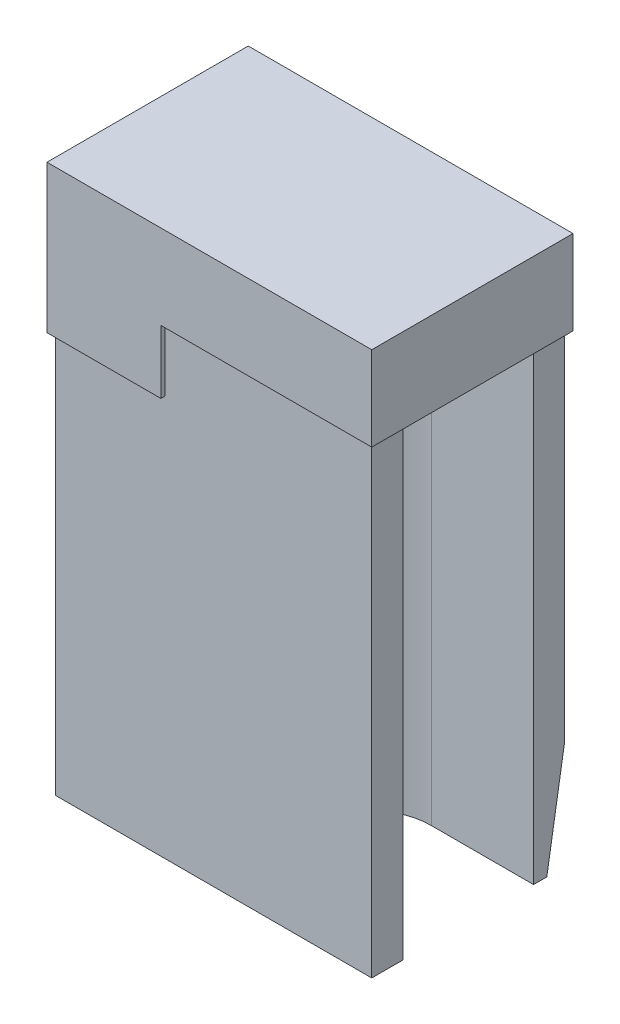
ISO-10303-21;
HEADER;
FILE_DESCRIPTION(('STEP AP214'),'2;1');
FILE_NAME('part.step','',(''),(''),'','','');
FILE_SCHEMA(('AUTOMOTIVE_DESIGN { 1 0 10303 214 1 1 1 1 }'));
ENDSEC;
DATA;
#1=APPLICATION_CONTEXT('core data for automotive mechanical design processes');
#2=APPLICATION_PROTOCOL_DEFINITION('international standard','automotive_design',2000,#1);
#3=PRODUCT_CONTEXT('',#1,'mechanical');
#4=PRODUCT('Part','Part','',(#3));
#5=PRODUCT_RELATED_PRODUCT_CATEGORY('part','',(#4));
#6=PRODUCT_DEFINITION_FORMATION('','',#4);
#7=PRODUCT_DEFINITION_CONTEXT('part definition',#1,'design');
#8=PRODUCT_DEFINITION('design','',#6,#7);
#9=PRODUCT_DEFINITION_SHAPE('','',#8);
#10=(LENGTH_UNIT() NAMED_UNIT(*) SI_UNIT(.MILLI.,.METRE.));
#11=(NAMED_UNIT(*) PLANE_ANGLE_UNIT() SI_UNIT($,.RADIAN.));
#12=(NAMED_UNIT(*) SI_UNIT($,.STERADIAN.) SOLID_ANGLE_UNIT());
#13=UNCERTAINTY_MEASURE_WITH_UNIT(LENGTH_MEASURE(1.E-05),#10,'distance_accuracy_value','');
#14=(GEOMETRIC_REPRESENTATION_CONTEXT(3) GLOBAL_UNCERTAINTY_ASSIGNED_CONTEXT((#13)) GLOBAL_UNIT_ASSIGNED_CONTEXT((#10,
#11,#12)) REPRESENTATION_CONTEXT('',''));
#15=CARTESIAN_POINT('',(0.,0.,0.));
#16=DIRECTION('',(0.,0.,1.));
#17=DIRECTION('',(1.,0.,0.));
#18=AXIS2_PLACEMENT_3D('',#15,#16,#17);
#19=CARTESIAN_POINT('',(-50.8,95.,-22.86));
#20=DIRECTION('',(1.,0.,0.));
#21=DIRECTION('',(0.,0.,-1.));
#22=AXIS2_PLACEMENT_3D('',#19,#20,#21);
#23=PLANE('',#22);
#24=DIRECTION('',(0.,-1.,0.));
#25=VECTOR('',#24,1.);
#26=CARTESIAN_POINT('',(-50.8,95.,-22.86));
#27=LINE('',#26,#25);
#28=CARTESIAN_POINT('',(-50.8,95.,-22.86));
#29=VERTEX_POINT('',#28);
#30=CARTESIAN_POINT('',(-50.8,25.5524,-22.86));
#31=VERTEX_POINT('',#30);
#32=EDGE_CURVE('E253',#29,#31,#27,.T.);
#33=ORIENTED_EDGE('',*,*,#32,.T.);
#34=DIRECTION('',(0.,-0.986657715435994,0.162808330777709));
#35=VECTOR('',#34,1.);
#36=CARTESIAN_POINT('',(-50.8,0.,-18.6436));
#37=LINE('',#36,#35);
#38=CARTESIAN_POINT('',(-50.8,0.,-18.6436));
#39=VERTEX_POINT('',#38);
#40=EDGE_CURVE('E236',#31,#39,#37,.T.);
#41=ORIENTED_EDGE('',*,*,#40,.T.);
#42=DIRECTION('',(0.,0.,1.));
#43=VECTOR('',#42,1.);
#44=CARTESIAN_POINT('',(-50.8,0.,-22.86));
#45=LINE('',#44,#43);
#46=CARTESIAN_POINT('',(-50.8,0.,22.86));
#47=VERTEX_POINT('',#46);
#48=EDGE_CURVE('E243',#39,#47,#45,.T.);
#49=ORIENTED_EDGE('',*,*,#48,.T.);
#50=DIRECTION('',(0.,-1.,0.));
#51=VECTOR('',#50,1.);
#52=CARTESIAN_POINT('',(-50.8,95.,22.86));
#53=LINE('',#52,#51);
#54=CARTESIAN_POINT('',(-50.8,95.,22.86));
#55=VERTEX_POINT('',#54);
#56=EDGE_CURVE('E11',#55,#47,#53,.T.);
#57=ORIENTED_EDGE('',*,*,#56,.F.);
#58=DIRECTION('',(0.,0.,1.));
#59=VECTOR('',#58,1.);
#60=CARTESIAN_POINT('',(-50.8,95.,-22.86));
#61=LINE('',#60,#59);
#62=EDGE_CURVE('E245',#29,#55,#61,.T.);
#63=ORIENTED_EDGE('',*,*,#62,.F.);
#64=EDGE_LOOP('',(#33,#41,#49,#57,#63));
#65=FACE_BOUND('',#64,.T.);
#66=ADVANCED_FACE('F34',(#65),#23,.F.);
#67=CARTESIAN_POINT('',(-50.8,95.,22.86));
#68=DIRECTION('',(0.,0.,-1.));
#69=DIRECTION('',(-1.,0.,0.));
#70=AXIS2_PLACEMENT_3D('',#67,#68,#69);
#71=PLANE('',#70);
#72=DIRECTION('',(1.,0.,0.));
#73=VECTOR('',#72,1.);
#74=CARTESIAN_POINT('',(-50.8,0.,22.86));
#75=LINE('',#74,#73);
#76=CARTESIAN_POINT('',(24.2,0.,22.86));
#77=VERTEX_POINT('',#76);
#78=EDGE_CURVE('E255',#47,#77,#75,.T.);
#79=ORIENTED_EDGE('',*,*,#78,.T.);
#80=DIRECTION('',(0.,-1.,0.));
#81=VECTOR('',#80,1.);
#82=CARTESIAN_POINT('',(24.2,95.,22.86));
#83=LINE('',#82,#81);
#84=CARTESIAN_POINT('',(24.2,110.,22.86));
#85=VERTEX_POINT('',#84);
#86=EDGE_CURVE('E41',#85,#77,#83,.T.);
#87=ORIENTED_EDGE('',*,*,#86,.F.);
#88=DIRECTION('',(1.,0.,0.));
#89=VECTOR('',#88,1.);
#90=CARTESIAN_POINT('',(0.,110.,22.86));
#91=LINE('',#90,#89);
#92=CARTESIAN_POINT('',(-24.8,110.,22.86));
#93=VERTEX_POINT('',#92);
#94=EDGE_CURVE('E214',#93,#85,#91,.T.);
#95=ORIENTED_EDGE('',*,*,#94,.F.);
#96=DIRECTION('',(0.,-1.,0.));
#97=VECTOR('',#96,1.);
#98=CARTESIAN_POINT('',(-24.8,110.,22.86));
#99=LINE('',#98,#97);
#100=CARTESIAN_POINT('',(-24.8,95.,22.86));
#101=VERTEX_POINT('',#100);
#102=EDGE_CURVE('E232',#93,#101,#99,.T.);
#103=ORIENTED_EDGE('',*,*,#102,.T.);
#104=DIRECTION('',(1.,0.,0.));
#105=VECTOR('',#104,1.);
#106=CARTESIAN_POINT('',(-50.8,95.,22.86));
#107=LINE('',#106,#105);
#108=EDGE_CURVE('E248',#55,#101,#107,.T.);
#109=ORIENTED_EDGE('',*,*,#108,.F.);
#110=ORIENTED_EDGE('',*,*,#56,.T.);
#111=EDGE_LOOP('',(#79,#87,#95,#103,#109,#110));
#112=FACE_BOUND('',#111,.T.);
#113=ADVANCED_FACE('F308',(#112),#71,.F.);
#114=CARTESIAN_POINT('',(24.2,95.,15.5));
#115=DIRECTION('',(-1.,0.,0.));
#116=DIRECTION('',(0.,0.,1.));
#117=AXIS2_PLACEMENT_3D('',#114,#115,#116);
#118=PLANE('',#117);
#119=DIRECTION('',(0.,0.,-1.));
#120=VECTOR('',#119,1.);
#121=CARTESIAN_POINT('',(24.2,0.,15.5));
#122=LINE('',#121,#120);
#123=CARTESIAN_POINT('',(24.2,0.,15.5));
#124=VERTEX_POINT('',#123);
#125=EDGE_CURVE('E257',#77,#124,#122,.T.);
#126=ORIENTED_EDGE('',*,*,#125,.T.);
#127=DIRECTION('',(0.,-1.,0.));
#128=VECTOR('',#127,1.);
#129=CARTESIAN_POINT('',(24.2,95.,15.5));
#130=LINE('',#129,#128);
#131=CARTESIAN_POINT('',(24.2,110.,15.5));
#132=VERTEX_POINT('',#131);
#133=EDGE_CURVE('E281',#132,#124,#130,.T.);
#134=ORIENTED_EDGE('',*,*,#133,.F.);
#135=DIRECTION('',(0.,0.,-1.));
#136=VECTOR('',#135,1.);
#137=CARTESIAN_POINT('',(24.2,110.,0.));
#138=LINE('',#137,#136);
#139=EDGE_CURVE('E217',#85,#132,#138,.T.);
#140=ORIENTED_EDGE('',*,*,#139,.F.);
#141=ORIENTED_EDGE('',*,*,#86,.T.);
#142=EDGE_LOOP('',(#126,#134,#140,#141));
#143=FACE_BOUND('',#142,.T.);
#144=ADVANCED_FACE('F287',(#143),#118,.F.);
#145=CARTESIAN_POINT('',(0.,95.,15.5));
#146=DIRECTION('',(0.,0.,1.));
#147=DIRECTION('',(1.,0.,0.));
#148=AXIS2_PLACEMENT_3D('',#145,#146,#147);
#149=PLANE('',#148);
#150=DIRECTION('',(-1.,0.,0.));
#151=VECTOR('',#150,1.);
#152=CARTESIAN_POINT('',(0.,0.,15.5));
#153=LINE('',#152,#151);
#154=CARTESIAN_POINT('',(0.,0.,15.5));
#155=VERTEX_POINT('',#154);
#156=EDGE_CURVE('E259',#124,#155,#153,.T.);
#157=ORIENTED_EDGE('',*,*,#156,.T.);
#158=DIRECTION('',(0.,-1.,0.));
#159=VECTOR('',#158,1.);
#160=CARTESIAN_POINT('',(0.,95.,15.5));
#161=LINE('',#160,#159);
#162=CARTESIAN_POINT('',(0.,110.,15.5));
#163=VERTEX_POINT('',#162);
#164=EDGE_CURVE('E278',#163,#155,#161,.T.);
#165=ORIENTED_EDGE('',*,*,#164,.F.);
#166=DIRECTION('',(-1.,0.,0.));
#167=VECTOR('',#166,1.);
#168=CARTESIAN_POINT('',(0.,110.,15.5));
#169=LINE('',#168,#167);
#170=EDGE_CURVE('E220',#132,#163,#169,.T.);
#171=ORIENTED_EDGE('',*,*,#170,.F.);
#172=ORIENTED_EDGE('',*,*,#133,.T.);
#173=EDGE_LOOP('',(#157,#165,#171,#172));
#174=FACE_BOUND('',#173,.T.);
#175=ADVANCED_FACE('F297',(#174),#149,.F.);
#176=CARTESIAN_POINT('',(0.,95.,0.));
#177=DIRECTION('',(0.,-1.,0.));
#178=DIRECTION('',(0.,0.,-1.));
#179=AXIS2_PLACEMENT_3D('',#176,#177,#178);
#180=CYLINDRICAL_SURFACE('',#179,15.5);
#181=CARTESIAN_POINT('',(0.,0.,0.));
#182=DIRECTION('',(0.,-1.,0.));
#183=DIRECTION('',(0.,0.,1.));
#184=AXIS2_PLACEMENT_3D('',#181,#182,#183);
#185=CIRCLE('',#184,15.5);
#186=CARTESIAN_POINT('',(0.,0.,-15.5));
#187=VERTEX_POINT('',#186);
#188=EDGE_CURVE('E261',#155,#187,#185,.T.);
#189=ORIENTED_EDGE('',*,*,#188,.T.);
#190=DIRECTION('',(0.,-1.,0.));
#191=VECTOR('',#190,1.);
#192=CARTESIAN_POINT('',(0.,95.,-15.5));
#193=LINE('',#192,#191);
#194=CARTESIAN_POINT('',(0.,110.,-15.5));
#195=VERTEX_POINT('',#194);
#196=EDGE_CURVE('E275',#195,#187,#193,.T.);
#197=ORIENTED_EDGE('',*,*,#196,.F.);
#198=CARTESIAN_POINT('',(0.,110.,0.));
#199=DIRECTION('',(0.,1.,0.));
#200=DIRECTION('',(0.,0.,1.));
#201=AXIS2_PLACEMENT_3D('',#198,#199,#200);
#202=CIRCLE('',#201,15.5);
#203=EDGE_CURVE('E223',#163,#195,#202,.F.);
#204=ORIENTED_EDGE('',*,*,#203,.F.);
#205=ORIENTED_EDGE('',*,*,#164,.T.);
#206=EDGE_LOOP('',(#189,#197,#204,#205));
#207=FACE_BOUND('',#206,.T.);
#208=ADVANCED_FACE('F301',(#207),#180,.F.);
#209=CARTESIAN_POINT('',(0.,95.,-15.5));
#210=DIRECTION('',(0.,0.,-1.));
#211=DIRECTION('',(-1.,0.,0.));
#212=AXIS2_PLACEMENT_3D('',#209,#210,#211);
#213=PLANE('',#212);
#214=DIRECTION('',(1.,0.,0.));
#215=VECTOR('',#214,1.);
#216=CARTESIAN_POINT('',(0.,0.,-15.5));
#217=LINE('',#216,#215);
#218=CARTESIAN_POINT('',(24.2,0.,-15.5));
#219=VERTEX_POINT('',#218);
#220=EDGE_CURVE('E263',#187,#219,#217,.T.);
#221=ORIENTED_EDGE('',*,*,#220,.T.);
#222=DIRECTION('',(0.,-1.,0.));
#223=VECTOR('',#222,1.);
#224=CARTESIAN_POINT('',(24.2,95.,-15.5));
#225=LINE('',#224,#223);
#226=CARTESIAN_POINT('',(24.2,110.,-15.5));
#227=VERTEX_POINT('',#226);
#228=EDGE_CURVE('E272',#227,#219,#225,.T.);
#229=ORIENTED_EDGE('',*,*,#228,.F.);
#230=DIRECTION('',(1.,0.,0.));
#231=VECTOR('',#230,1.);
#232=CARTESIAN_POINT('',(0.,110.,-15.5));
#233=LINE('',#232,#231);
#234=EDGE_CURVE('E226',#195,#227,#233,.T.);
#235=ORIENTED_EDGE('',*,*,#234,.F.);
#236=ORIENTED_EDGE('',*,*,#196,.T.);
#237=EDGE_LOOP('',(#221,#229,#235,#236));
#238=FACE_BOUND('',#237,.T.);
#239=ADVANCED_FACE('F333',(#238),#213,.F.);
#240=CARTESIAN_POINT('',(24.2,95.,-22.86));
#241=DIRECTION('',(-1.,0.,0.));
#242=DIRECTION('',(0.,0.,1.));
#243=AXIS2_PLACEMENT_3D('',#240,#241,#242);
#244=PLANE('',#243);
#245=DIRECTION('',(0.,0.,-1.));
#246=VECTOR('',#245,1.);
#247=CARTESIAN_POINT('',(24.2,0.,-22.86));
#248=LINE('',#247,#246);
#249=CARTESIAN_POINT('',(24.2,0.,-18.6436));
#250=VERTEX_POINT('',#249);
#251=EDGE_CURVE('E249',#219,#250,#248,.T.);
#252=ORIENTED_EDGE('',*,*,#251,.T.);
#253=DIRECTION('',(0.,-0.986657715435994,0.162808330777709));
#254=VECTOR('',#253,1.);
#255=CARTESIAN_POINT('',(24.2,0.,-18.6436));
#256=LINE('',#255,#254);
#257=CARTESIAN_POINT('',(24.2,25.5524,-22.86));
#258=VERTEX_POINT('',#257);
#259=EDGE_CURVE('E56',#258,#250,#256,.T.);
#260=ORIENTED_EDGE('',*,*,#259,.F.);
#261=DIRECTION('',(0.,-1.,0.));
#262=VECTOR('',#261,1.);
#263=CARTESIAN_POINT('',(24.2,95.,-22.86));
#264=LINE('',#263,#262);
#265=CARTESIAN_POINT('',(24.2,110.,-22.86));
#266=VERTEX_POINT('',#265);
#267=EDGE_CURVE('E269',#266,#258,#264,.T.);
#268=ORIENTED_EDGE('',*,*,#267,.F.);
#269=DIRECTION('',(0.,0.,-1.));
#270=VECTOR('',#269,1.);
#271=CARTESIAN_POINT('',(24.2,110.,0.));
#272=LINE('',#271,#270);
#273=EDGE_CURVE('E229',#227,#266,#272,.T.);
#274=ORIENTED_EDGE('',*,*,#273,.F.);
#275=ORIENTED_EDGE('',*,*,#228,.T.);
#276=EDGE_LOOP('',(#252,#260,#268,#274,#275));
#277=FACE_BOUND('',#276,.T.);
#278=ADVANCED_FACE('F331',(#277),#244,.F.);
#279=CARTESIAN_POINT('',(-50.8,95.,-22.86));
#280=DIRECTION('',(0.,0.,1.));
#281=DIRECTION('',(1.,0.,0.));
#282=AXIS2_PLACEMENT_3D('',#279,#280,#281);
#283=PLANE('',#282);
#284=ORIENTED_EDGE('',*,*,#267,.T.);
#285=DIRECTION('',(1.,0.,0.));
#286=VECTOR('',#285,1.);
#287=CARTESIAN_POINT('',(-50.8,25.5524,-22.86));
#288=LINE('',#287,#286);
#289=EDGE_CURVE('E239',#31,#258,#288,.T.);
#290=ORIENTED_EDGE('',*,*,#289,.F.);
#291=ORIENTED_EDGE('',*,*,#32,.F.);
#292=DIRECTION('',(-1.,0.,0.));
#293=VECTOR('',#292,1.);
#294=CARTESIAN_POINT('',(-50.8,95.,-22.86));
#295=LINE('',#294,#293);
#296=CARTESIAN_POINT('',(-24.8,95.,-22.86));
#297=VERTEX_POINT('',#296);
#298=EDGE_CURVE('E48',#297,#29,#295,.T.);
#299=ORIENTED_EDGE('',*,*,#298,.F.);
#300=DIRECTION('',(0.,-1.,0.));
#301=VECTOR('',#300,1.);
#302=CARTESIAN_POINT('',(-24.8,110.,-22.86));
#303=LINE('',#302,#301);
#304=CARTESIAN_POINT('',(-24.8,110.,-22.86));
#305=VERTEX_POINT('',#304);
#306=EDGE_CURVE('E234',#305,#297,#303,.T.);
#307=ORIENTED_EDGE('',*,*,#306,.F.);
#308=DIRECTION('',(-1.,0.,0.));
#309=VECTOR('',#308,1.);
#310=CARTESIAN_POINT('',(0.,110.,-22.86));
#311=LINE('',#310,#309);
#312=EDGE_CURVE('E212',#266,#305,#311,.T.);
#313=ORIENTED_EDGE('',*,*,#312,.F.);
#314=EDGE_LOOP('',(#284,#290,#291,#299,#307,#313));
#315=FACE_BOUND('',#314,.T.);
#316=ADVANCED_FACE('F326',(#315),#283,.F.);
#317=CARTESIAN_POINT('',(0.,0.,0.));
#318=DIRECTION('',(0.,1.,0.));
#319=DIRECTION('',(0.,0.,1.));
#320=AXIS2_PLACEMENT_3D('',#317,#318,#319);
#321=PLANE('',#320);
#322=ORIENTED_EDGE('',*,*,#48,.F.);
#323=DIRECTION('',(1.,0.,0.));
#324=VECTOR('',#323,1.);
#325=CARTESIAN_POINT('',(-50.8,0.,-18.6436));
#326=LINE('',#325,#324);
#327=EDGE_CURVE('E241',#39,#250,#326,.T.);
#328=ORIENTED_EDGE('',*,*,#327,.T.);
#329=ORIENTED_EDGE('',*,*,#251,.F.);
#330=ORIENTED_EDGE('',*,*,#220,.F.);
#331=ORIENTED_EDGE('',*,*,#188,.F.);
#332=ORIENTED_EDGE('',*,*,#156,.F.);
#333=ORIENTED_EDGE('',*,*,#125,.F.);
#334=ORIENTED_EDGE('',*,*,#78,.F.);
#335=EDGE_LOOP('',(#322,#328,#329,#330,#331,#332,#333,#334));
#336=FACE_BOUND('',#335,.T.);
#337=ADVANCED_FACE('F293',(#336),#321,.F.);
#338=CARTESIAN_POINT('',(-50.8,0.,-18.6436));
#339=DIRECTION('',(0.,0.162808330777709,0.986657715435995));
#340=DIRECTION('',(0.,-0.986657715435995,0.162808330777709));
#341=AXIS2_PLACEMENT_3D('',#338,#339,#340);
#342=PLANE('',#341);
#343=ORIENTED_EDGE('',*,*,#259,.T.);
#344=ORIENTED_EDGE('',*,*,#327,.F.);
#345=ORIENTED_EDGE('',*,*,#40,.F.);
#346=ORIENTED_EDGE('',*,*,#289,.T.);
#347=EDGE_LOOP('',(#343,#344,#345,#346));
#348=FACE_BOUND('',#347,.T.);
#349=ADVANCED_FACE('F335',(#348),#342,.F.);
#350=CARTESIAN_POINT('',(25.2,130.,-23.86));
#351=DIRECTION('',(-1.,0.,0.));
#352=DIRECTION('',(0.,0.,1.));
#353=AXIS2_PLACEMENT_3D('',#350,#351,#352);
#354=PLANE('',#353);
#355=DIRECTION('',(0.,0.,-1.));
#356=VECTOR('',#355,1.);
#357=CARTESIAN_POINT('',(25.2,110.,-23.86));
#358=LINE('',#357,#356);
#359=CARTESIAN_POINT('',(25.2,110.,23.86));
#360=VERTEX_POINT('',#359);
#361=CARTESIAN_POINT('',(25.2,110.,-23.86));
#362=VERTEX_POINT('',#361);
#363=EDGE_CURVE('E194',#360,#362,#358,.T.);
#364=ORIENTED_EDGE('',*,*,#363,.T.);
#365=DIRECTION('',(0.,-1.,0.));
#366=VECTOR('',#365,1.);
#367=CARTESIAN_POINT('',(25.2,130.,-23.86));
#368=LINE('',#367,#366);
#369=CARTESIAN_POINT('',(25.2,130.,-23.86));
#370=VERTEX_POINT('',#369);
#371=EDGE_CURVE('E210',#370,#362,#368,.T.);
#372=ORIENTED_EDGE('',*,*,#371,.F.);
#373=DIRECTION('',(0.,0.,-1.));
#374=VECTOR('',#373,1.);
#375=CARTESIAN_POINT('',(25.2,130.,-23.86));
#376=LINE('',#375,#374);
#377=CARTESIAN_POINT('',(25.2,130.,23.86));
#378=VERTEX_POINT('',#377);
#379=EDGE_CURVE('E160',#378,#370,#376,.T.);
#380=ORIENTED_EDGE('',*,*,#379,.F.);
#381=DIRECTION('',(0.,-1.,0.));
#382=VECTOR('',#381,1.);
#383=CARTESIAN_POINT('',(25.2,130.,23.86));
#384=LINE('',#383,#382);
#385=EDGE_CURVE('E198',#378,#360,#384,.T.);
#386=ORIENTED_EDGE('',*,*,#385,.T.);
#387=EDGE_LOOP('',(#364,#372,#380,#386));
#388=FACE_BOUND('',#387,.T.);
#389=ADVANCED_FACE('F361',(#388),#354,.F.);
#390=CARTESIAN_POINT('',(25.2,130.,-23.86));
#391=DIRECTION('',(0.,0.,1.));
#392=DIRECTION('',(1.,0.,0.));
#393=AXIS2_PLACEMENT_3D('',#390,#391,#392);
#394=PLANE('',#393);
#395=DIRECTION('',(-1.,0.,0.));
#396=VECTOR('',#395,1.);
#397=CARTESIAN_POINT('',(25.2,110.,-23.86));
#398=LINE('',#397,#396);
#399=CARTESIAN_POINT('',(-24.8,110.,-23.86));
#400=VERTEX_POINT('',#399);
#401=EDGE_CURVE('E201',#362,#400,#398,.T.);
#402=ORIENTED_EDGE('',*,*,#401,.T.);
#403=DIRECTION('',(0.,-1.,0.));
#404=VECTOR('',#403,1.);
#405=CARTESIAN_POINT('',(-24.8,130.,-23.86));
#406=LINE('',#405,#404);
#407=CARTESIAN_POINT('',(-24.8,95.,-23.86));
#408=VERTEX_POINT('',#407);
#409=EDGE_CURVE('E173',#400,#408,#406,.T.);
#410=ORIENTED_EDGE('',*,*,#409,.T.);
#411=DIRECTION('',(-1.,0.,0.));
#412=VECTOR('',#411,1.);
#413=CARTESIAN_POINT('',(-24.8,95.,-23.86));
#414=LINE('',#413,#412);
#415=CARTESIAN_POINT('',(-51.8,95.,-23.86));
#416=VERTEX_POINT('',#415);
#417=EDGE_CURVE('E170',#408,#416,#414,.T.);
#418=ORIENTED_EDGE('',*,*,#417,.T.);
#419=DIRECTION('',(0.,-1.,0.));
#420=VECTOR('',#419,1.);
#421=CARTESIAN_POINT('',(-51.8,130.,-23.86));
#422=LINE('',#421,#420);
#423=CARTESIAN_POINT('',(-51.8,130.,-23.86));
#424=VERTEX_POINT('',#423);
#425=EDGE_CURVE('E167',#424,#416,#422,.T.);
#426=ORIENTED_EDGE('',*,*,#425,.F.);
#427=DIRECTION('',(-1.,0.,0.));
#428=VECTOR('',#427,1.);
#429=CARTESIAN_POINT('',(25.2,130.,-23.86));
#430=LINE('',#429,#428);
#431=EDGE_CURVE('E153',#370,#424,#430,.T.);
#432=ORIENTED_EDGE('',*,*,#431,.F.);
#433=ORIENTED_EDGE('',*,*,#371,.T.);
#434=EDGE_LOOP('',(#402,#410,#418,#426,#432,#433));
#435=FACE_BOUND('',#434,.T.);
#436=ADVANCED_FACE('F168',(#435),#394,.F.);
#437=CARTESIAN_POINT('',(25.2,130.,23.86));
#438=DIRECTION('',(0.,0.,-1.));
#439=DIRECTION('',(-1.,0.,0.));
#440=AXIS2_PLACEMENT_3D('',#437,#438,#439);
#441=PLANE('',#440);
#442=DIRECTION('',(1.,0.,0.));
#443=VECTOR('',#442,1.);
#444=CARTESIAN_POINT('',(25.2,110.,23.86));
#445=LINE('',#444,#443);
#446=CARTESIAN_POINT('',(-24.8,110.,23.86));
#447=VERTEX_POINT('',#446);
#448=EDGE_CURVE('E195',#447,#360,#445,.T.);
#449=ORIENTED_EDGE('',*,*,#448,.T.);
#450=ORIENTED_EDGE('',*,*,#385,.F.);
#451=DIRECTION('',(1.,0.,0.));
#452=VECTOR('',#451,1.);
#453=CARTESIAN_POINT('',(25.2,130.,23.86));
#454=LINE('',#453,#452);
#455=CARTESIAN_POINT('',(-51.8,130.,23.86));
#456=VERTEX_POINT('',#455);
#457=EDGE_CURVE('E164',#456,#378,#454,.T.);
#458=ORIENTED_EDGE('',*,*,#457,.F.);
#459=DIRECTION('',(0.,-1.,0.));
#460=VECTOR('',#459,1.);
#461=CARTESIAN_POINT('',(-51.8,130.,23.86));
#462=LINE('',#461,#460);
#463=CARTESIAN_POINT('',(-51.8,95.,23.86));
#464=VERTEX_POINT('',#463);
#465=EDGE_CURVE('E174',#456,#464,#462,.T.);
#466=ORIENTED_EDGE('',*,*,#465,.T.);
#467=DIRECTION('',(1.,0.,0.));
#468=VECTOR('',#467,1.);
#469=CARTESIAN_POINT('',(-24.8,95.,23.86));
#470=LINE('',#469,#468);
#471=CARTESIAN_POINT('',(-24.8,95.,23.86));
#472=VERTEX_POINT('',#471);
#473=EDGE_CURVE('E179',#464,#472,#470,.T.);
#474=ORIENTED_EDGE('',*,*,#473,.T.);
#475=DIRECTION('',(0.,-1.,0.));
#476=VECTOR('',#475,1.);
#477=CARTESIAN_POINT('',(-24.8,130.,23.86));
#478=LINE('',#477,#476);
#479=EDGE_CURVE('E178',#447,#472,#478,.T.);
#480=ORIENTED_EDGE('',*,*,#479,.F.);
#481=EDGE_LOOP('',(#449,#450,#458,#466,#474,#480));
#482=FACE_BOUND('',#481,.T.);
#483=ADVANCED_FACE('F319',(#482),#441,.F.);
#484=CARTESIAN_POINT('',(0.,130.,0.));
#485=DIRECTION('',(0.,-1.,0.));
#486=DIRECTION('',(0.,0.,-1.));
#487=AXIS2_PLACEMENT_3D('',#484,#485,#486);
#488=PLANE('',#487);
#489=ORIENTED_EDGE('',*,*,#379,.T.);
#490=ORIENTED_EDGE('',*,*,#431,.T.);
#491=DIRECTION('',(0.,0.,1.));
#492=VECTOR('',#491,1.);
#493=CARTESIAN_POINT('',(-51.8,130.,-23.86));
#494=LINE('',#493,#492);
#495=EDGE_CURVE('E157',#424,#456,#494,.T.);
#496=ORIENTED_EDGE('',*,*,#495,.T.);
#497=ORIENTED_EDGE('',*,*,#457,.T.);
#498=EDGE_LOOP('',(#489,#490,#496,#497));
#499=FACE_BOUND('',#498,.T.);
#500=ADVANCED_FACE('F155',(#499),#488,.F.);
#501=CARTESIAN_POINT('',(0.,110.,0.));
#502=DIRECTION('',(0.,-1.,0.));
#503=DIRECTION('',(0.,0.,-1.));
#504=AXIS2_PLACEMENT_3D('',#501,#502,#503);
#505=PLANE('',#504);
#506=ORIENTED_EDGE('',*,*,#273,.T.);
#507=ORIENTED_EDGE('',*,*,#312,.T.);
#508=DIRECTION('',(0.,0.,1.));
#509=VECTOR('',#508,1.);
#510=CARTESIAN_POINT('',(-24.8,110.,-23.86));
#511=LINE('',#510,#509);
#512=EDGE_CURVE('E204',#400,#305,#511,.T.);
#513=ORIENTED_EDGE('',*,*,#512,.F.);
#514=ORIENTED_EDGE('',*,*,#401,.F.);
#515=ORIENTED_EDGE('',*,*,#363,.F.);
#516=ORIENTED_EDGE('',*,*,#448,.F.);
#517=EDGE_CURVE('E203',#93,#447,#511,.T.);
#518=ORIENTED_EDGE('',*,*,#517,.F.);
#519=ORIENTED_EDGE('',*,*,#94,.T.);
#520=ORIENTED_EDGE('',*,*,#139,.T.);
#521=ORIENTED_EDGE('',*,*,#170,.T.);
#522=ORIENTED_EDGE('',*,*,#203,.T.);
#523=ORIENTED_EDGE('',*,*,#234,.T.);
#524=EDGE_LOOP('',(#506,#507,#513,#514,#515,#516,#518,#519,#520,#521,#522,#523));
#525=FACE_BOUND('',#524,.T.);
#526=ADVANCED_FACE('F304',(#525),#505,.T.);
#527=CARTESIAN_POINT('',(0.,95.,0.));
#528=DIRECTION('',(0.,-1.,0.));
#529=DIRECTION('',(0.,0.,-1.));
#530=AXIS2_PLACEMENT_3D('',#527,#528,#529);
#531=PLANE('',#530);
#532=ORIENTED_EDGE('',*,*,#108,.T.);
#533=DIRECTION('',(0.,0.,-1.));
#534=VECTOR('',#533,1.);
#535=CARTESIAN_POINT('',(-24.8,95.,-23.86));
#536=LINE('',#535,#534);
#537=EDGE_CURVE('E186',#472,#101,#536,.T.);
#538=ORIENTED_EDGE('',*,*,#537,.F.);
#539=ORIENTED_EDGE('',*,*,#473,.F.);
#540=DIRECTION('',(0.,0.,1.));
#541=VECTOR('',#540,1.);
#542=CARTESIAN_POINT('',(-51.8,95.,-23.86));
#543=LINE('',#542,#541);
#544=EDGE_CURVE('E183',#416,#464,#543,.T.);
#545=ORIENTED_EDGE('',*,*,#544,.F.);
#546=ORIENTED_EDGE('',*,*,#417,.F.);
#547=EDGE_CURVE('E189',#297,#408,#536,.T.);
#548=ORIENTED_EDGE('',*,*,#547,.F.);
#549=ORIENTED_EDGE('',*,*,#298,.T.);
#550=ORIENTED_EDGE('',*,*,#62,.T.);
#551=EDGE_LOOP('',(#532,#538,#539,#545,#546,#548,#549,#550));
#552=FACE_BOUND('',#551,.T.);
#553=ADVANCED_FACE('F313',(#552),#531,.T.);
#554=CARTESIAN_POINT('',(-24.8,130.,-23.86));
#555=DIRECTION('',(-1.,0.,0.));
#556=DIRECTION('',(0.,0.,1.));
#557=AXIS2_PLACEMENT_3D('',#554,#555,#556);
#558=PLANE('',#557);
#559=ORIENTED_EDGE('',*,*,#537,.T.);
#560=ORIENTED_EDGE('',*,*,#102,.F.);
#561=ORIENTED_EDGE('',*,*,#517,.T.);
#562=ORIENTED_EDGE('',*,*,#479,.T.);
#563=EDGE_LOOP('',(#559,#560,#561,#562));
#564=FACE_BOUND('',#563,.T.);
#565=ADVANCED_FACE('F316',(#564),#558,.F.);
#566=ORIENTED_EDGE('',*,*,#512,.T.);
#567=ORIENTED_EDGE('',*,*,#306,.T.);
#568=ORIENTED_EDGE('',*,*,#547,.T.);
#569=ORIENTED_EDGE('',*,*,#409,.F.);
#570=EDGE_LOOP('',(#566,#567,#568,#569));
#571=FACE_BOUND('',#570,.T.);
#572=ADVANCED_FACE('F324',(#571),#558,.F.);
#573=CARTESIAN_POINT('',(-51.8,130.,-23.86));
#574=DIRECTION('',(1.,0.,0.));
#575=DIRECTION('',(0.,0.,-1.));
#576=AXIS2_PLACEMENT_3D('',#573,#574,#575);
#577=PLANE('',#576);
#578=ORIENTED_EDGE('',*,*,#544,.T.);
#579=ORIENTED_EDGE('',*,*,#465,.F.);
#580=ORIENTED_EDGE('',*,*,#495,.F.);
#581=ORIENTED_EDGE('',*,*,#425,.T.);
#582=EDGE_LOOP('',(#578,#579,#580,#581));
#583=FACE_BOUND('',#582,.T.);
#584=ADVANCED_FACE('F176',(#583),#577,.F.);
#585=CLOSED_SHELL('',(#66,#113,#144,#175,#208,#239,#278,#316,#337,#349,#389,#436,#483,#500,#526,
#553,#565,#572,#584));
#586=MANIFOLD_SOLID_BREP('B2',#585);
#587=ADVANCED_BREP_SHAPE_REPRESENTATION('',(#18,#586),#14);
#588=SHAPE_DEFINITION_REPRESENTATION(#9,#587);
ENDSEC;
END-ISO-10303-21;
